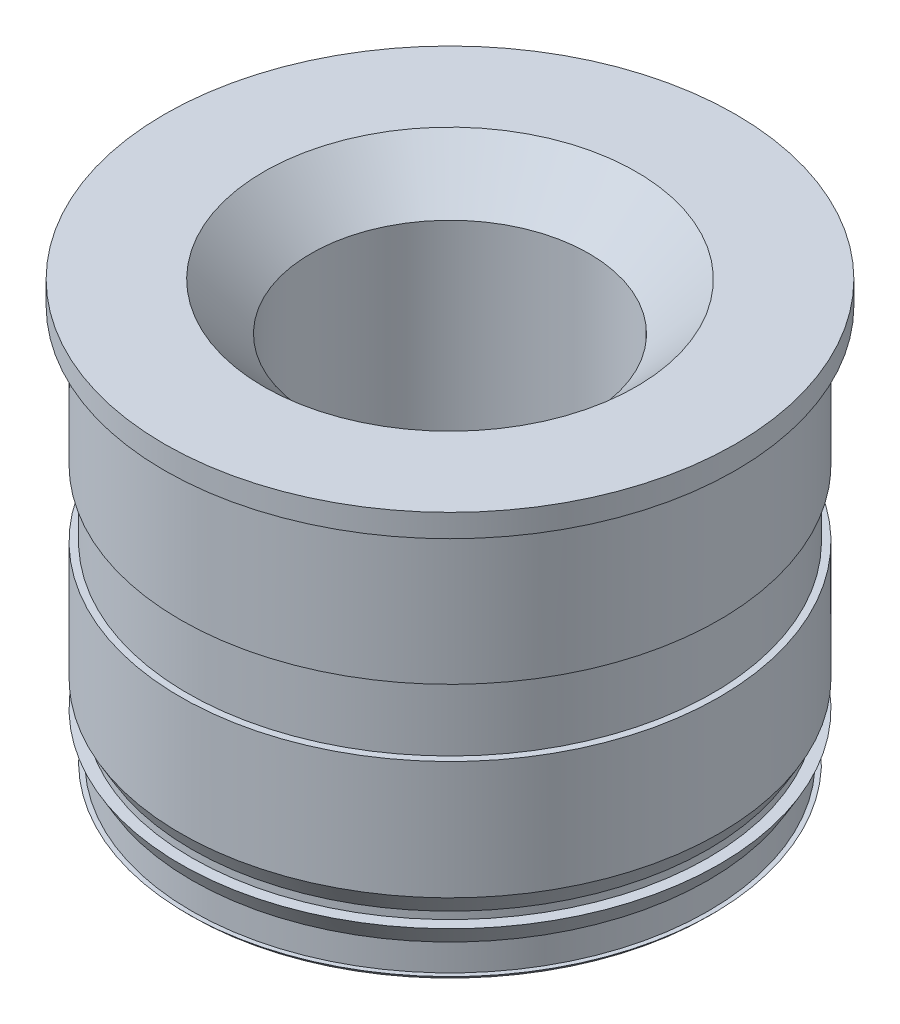
ISO-10303-21;
HEADER;
FILE_DESCRIPTION(('STEP AP214'),'2;1');
FILE_NAME('part.step','',(''),(''),'','','');
FILE_SCHEMA(('AUTOMOTIVE_DESIGN { 1 0 10303 214 1 1 1 1 }'));
ENDSEC;
DATA;
#1=APPLICATION_CONTEXT('core data for automotive mechanical design processes');
#2=APPLICATION_PROTOCOL_DEFINITION('international standard','automotive_design',2000,#1);
#3=PRODUCT_CONTEXT('',#1,'mechanical');
#4=PRODUCT('Part','Part','',(#3));
#5=PRODUCT_RELATED_PRODUCT_CATEGORY('part','',(#4));
#6=PRODUCT_DEFINITION_FORMATION('','',#4);
#7=PRODUCT_DEFINITION_CONTEXT('part definition',#1,'design');
#8=PRODUCT_DEFINITION('design','',#6,#7);
#9=PRODUCT_DEFINITION_SHAPE('','',#8);
#10=(LENGTH_UNIT() NAMED_UNIT(*) SI_UNIT(.MILLI.,.METRE.));
#11=(NAMED_UNIT(*) PLANE_ANGLE_UNIT() SI_UNIT($,.RADIAN.));
#12=(NAMED_UNIT(*) SI_UNIT($,.STERADIAN.) SOLID_ANGLE_UNIT());
#13=UNCERTAINTY_MEASURE_WITH_UNIT(LENGTH_MEASURE(1.E-05),#10,'distance_accuracy_value','');
#14=(GEOMETRIC_REPRESENTATION_CONTEXT(3) GLOBAL_UNCERTAINTY_ASSIGNED_CONTEXT((#13)) GLOBAL_UNIT_ASSIGNED_CONTEXT((#10,
#11,#12)) REPRESENTATION_CONTEXT('',''));
#15=CARTESIAN_POINT('',(0.,0.,0.));
#16=DIRECTION('',(0.,0.,1.));
#17=DIRECTION('',(1.,0.,0.));
#18=AXIS2_PLACEMENT_3D('',#15,#16,#17);
#19=CARTESIAN_POINT('',(0.,-3.83884618943233,0.));
#20=DIRECTION('',(0.,1.,0.));
#21=DIRECTION('',(0.,0.,1.));
#22=AXIS2_PLACEMENT_3D('',#19,#20,#21);
#23=CYLINDRICAL_SURFACE('',#22,2.995);
#24=CARTESIAN_POINT('',(0.,-2.52615127018922,0.));
#25=DIRECTION('',(0.,-1.,0.));
#26=DIRECTION('',(1.,0.,0.));
#27=AXIS2_PLACEMENT_3D('',#24,#25,#26);
#28=CIRCLE('',#27,2.995);
#29=CARTESIAN_POINT('',(2.995,-2.52615127018922,0.));
#30=VERTEX_POINT('',#29);
#31=EDGE_CURVE('E36',#30,#30,#28,.F.);
#32=ORIENTED_EDGE('',*,*,#31,.F.);
#33=EDGE_LOOP('',(#32));
#34=FACE_BOUND('',#33,.T.);
#35=CARTESIAN_POINT('',(0.,-3.83884618943233,0.));
#36=DIRECTION('',(0.,-1.,0.));
#37=DIRECTION('',(0.,0.,-1.));
#38=AXIS2_PLACEMENT_3D('',#35,#36,#37);
#39=CIRCLE('',#38,2.995);
#40=CARTESIAN_POINT('',(0.,-3.83884618943233,-2.995));
#41=VERTEX_POINT('',#40);
#42=EDGE_CURVE('E69',#41,#41,#39,.T.);
#43=ORIENTED_EDGE('',*,*,#42,.F.);
#44=EDGE_LOOP('',(#43));
#45=FACE_BOUND('',#44,.T.);
#46=ADVANCED_FACE('F32',(#34,#45),#23,.T.);
#47=CARTESIAN_POINT('',(0.,-4.7,0.));
#48=DIRECTION('',(0.,1.,0.));
#49=DIRECTION('',(0.,0.,1.));
#50=AXIS2_PLACEMENT_3D('',#47,#48,#49);
#51=CYLINDRICAL_SURFACE('',#50,2.87);
#52=CARTESIAN_POINT('',(0.,-4.13616991924311,0.));
#53=DIRECTION('',(0.,1.,0.));
#54=DIRECTION('',(-1.,0.,0.));
#55=AXIS2_PLACEMENT_3D('',#52,#53,#54);
#56=CIRCLE('',#55,2.87);
#57=CARTESIAN_POINT('',(-2.87,-4.13616991924311,0.));
#58=VERTEX_POINT('',#57);
#59=EDGE_CURVE('E92',#58,#58,#56,.F.);
#60=ORIENTED_EDGE('',*,*,#59,.F.);
#61=EDGE_LOOP('',(#60));
#62=FACE_BOUND('',#61,.T.);
#63=CARTESIAN_POINT('',(0.,-4.05535254037844,0.));
#64=DIRECTION('',(0.,-1.,0.));
#65=DIRECTION('',(0.,0.,-1.));
#66=AXIS2_PLACEMENT_3D('',#63,#64,#65);
#67=CIRCLE('',#66,2.87);
#68=CARTESIAN_POINT('',(0.,-4.05535254037844,-2.87));
#69=VERTEX_POINT('',#68);
#70=EDGE_CURVE('E82',#69,#69,#67,.F.);
#71=ORIENTED_EDGE('',*,*,#70,.F.);
#72=EDGE_LOOP('',(#71));
#73=FACE_BOUND('',#72,.T.);
#74=ADVANCED_FACE('F117',(#62,#73),#51,.T.);
#75=CARTESIAN_POINT('',(0.,-1.78320127018922,0.));
#76=DIRECTION('',(0.,1.,0.));
#77=DIRECTION('',(-1.,0.,0.));
#78=AXIS2_PLACEMENT_3D('',#75,#76,#77);
#79=CIRCLE('',#78,2.995);
#80=CARTESIAN_POINT('',(-2.995,-1.78320127018922,0.));
#81=VERTEX_POINT('',#80);
#82=EDGE_CURVE('E48',#81,#81,#79,.F.);
#83=ORIENTED_EDGE('',*,*,#82,.F.);
#84=EDGE_LOOP('',(#83));
#85=FACE_BOUND('',#84,.T.);
#86=CARTESIAN_POINT('',(0.,-0.254,0.));
#87=DIRECTION('',(0.,1.,0.));
#88=DIRECTION('',(0.,0.,1.));
#89=AXIS2_PLACEMENT_3D('',#86,#87,#88);
#90=CIRCLE('',#89,2.995);
#91=CARTESIAN_POINT('',(0.,-0.254,2.995));
#92=VERTEX_POINT('',#91);
#93=EDGE_CURVE('E76',#92,#92,#90,.F.);
#94=ORIENTED_EDGE('',*,*,#93,.T.);
#95=EDGE_LOOP('',(#94));
#96=FACE_BOUND('',#95,.T.);
#97=ADVANCED_FACE('F120',(#85,#96),#23,.T.);
#98=CARTESIAN_POINT('',(0.,-0.254,0.));
#99=DIRECTION('',(0.,1.,0.));
#100=DIRECTION('',(0.,0.,1.));
#101=AXIS2_PLACEMENT_3D('',#98,#99,#100);
#102=CYLINDRICAL_SURFACE('',#101,3.175);
#103=CARTESIAN_POINT('',(0.,-0.254,0.));
#104=DIRECTION('',(0.,1.,0.));
#105=DIRECTION('',(0.,0.,1.));
#106=AXIS2_PLACEMENT_3D('',#103,#104,#105);
#107=CIRCLE('',#106,3.175);
#108=CARTESIAN_POINT('',(0.,-0.254,3.175));
#109=VERTEX_POINT('',#108);
#110=EDGE_CURVE('E73',#109,#109,#107,.T.);
#111=ORIENTED_EDGE('',*,*,#110,.T.);
#112=EDGE_LOOP('',(#111));
#113=FACE_BOUND('',#112,.T.);
#114=CARTESIAN_POINT('',(0.,0.,0.));
#115=DIRECTION('',(0.,1.,0.));
#116=DIRECTION('',(0.,0.,1.));
#117=AXIS2_PLACEMENT_3D('',#114,#115,#116);
#118=CIRCLE('',#117,3.175);
#119=CARTESIAN_POINT('',(0.,0.,3.175));
#120=VERTEX_POINT('',#119);
#121=EDGE_CURVE('E72',#120,#120,#118,.T.);
#122=ORIENTED_EDGE('',*,*,#121,.F.);
#123=EDGE_LOOP('',(#122));
#124=FACE_BOUND('',#123,.T.);
#125=ADVANCED_FACE('F130',(#113,#124),#102,.T.);
#126=CARTESIAN_POINT('',(0.,-0.254,0.));
#127=DIRECTION('',(0.,1.,0.));
#128=DIRECTION('',(0.,0.,1.));
#129=AXIS2_PLACEMENT_3D('',#126,#127,#128);
#130=PLANE('',#129);
#131=ORIENTED_EDGE('',*,*,#93,.F.);
#132=EDGE_LOOP('',(#131));
#133=FACE_BOUND('',#132,.T.);
#134=ORIENTED_EDGE('',*,*,#110,.F.);
#135=EDGE_LOOP('',(#134));
#136=FACE_BOUND('',#135,.T.);
#137=ADVANCED_FACE('F135',(#133,#136),#130,.F.);
#138=CARTESIAN_POINT('',(0.,0.,0.));
#139=DIRECTION('',(0.,1.,0.));
#140=DIRECTION('',(0.,0.,1.));
#141=AXIS2_PLACEMENT_3D('',#138,#139,#140);
#142=PLANE('',#141);
#143=CARTESIAN_POINT('',(0.,0.,0.));
#144=DIRECTION('',(0.,1.,0.));
#145=DIRECTION('',(0.,0.,1.));
#146=AXIS2_PLACEMENT_3D('',#143,#144,#145);
#147=CIRCLE('',#146,2.07033666301317);
#148=CARTESIAN_POINT('',(0.,0.,2.07033666301317));
#149=VERTEX_POINT('',#148);
#150=EDGE_CURVE('E40',#149,#149,#147,.F.);
#151=ORIENTED_EDGE('',*,*,#150,.T.);
#152=EDGE_LOOP('',(#151));
#153=FACE_BOUND('',#152,.T.);
#154=ORIENTED_EDGE('',*,*,#121,.T.);
#155=EDGE_LOOP('',(#154));
#156=FACE_BOUND('',#155,.T.);
#157=ADVANCED_FACE('F142',(#153,#156),#142,.T.);
#158=CARTESIAN_POINT('',(0.,-3.83884618943233,0.));
#159=DIRECTION('',(0.,1.,0.));
#160=DIRECTION('',(0.,0.,-1.));
#161=AXIS2_PLACEMENT_3D('',#158,#159,#160);
#162=CONICAL_SURFACE('',#161,2.995,0.5235987755983);
#163=ORIENTED_EDGE('',*,*,#70,.T.);
#164=EDGE_LOOP('',(#163));
#165=FACE_BOUND('',#164,.T.);
#166=ORIENTED_EDGE('',*,*,#42,.T.);
#167=EDGE_LOOP('',(#166));
#168=FACE_BOUND('',#167,.T.);
#169=ADVANCED_FACE('F149',(#165,#168),#162,.T.);
#170=CARTESIAN_POINT('',(-2.995,-4.13616991924311,0.));
#171=DIRECTION('',(0.,1.,0.));
#172=DIRECTION('',(-1.,0.,0.));
#173=AXIS2_PLACEMENT_3D('',#170,#171,#172);
#174=PLANE('',#173);
#175=CARTESIAN_POINT('',(0.,-4.13616991924311,0.));
#176=DIRECTION('',(0.,1.,0.));
#177=DIRECTION('',(-1.,0.,0.));
#178=AXIS2_PLACEMENT_3D('',#175,#176,#177);
#179=CIRCLE('',#178,2.995);
#180=CARTESIAN_POINT('',(-2.995,-4.13616991924311,0.));
#181=VERTEX_POINT('',#180);
#182=EDGE_CURVE('E54',#181,#181,#179,.T.);
#183=ORIENTED_EDGE('',*,*,#182,.T.);
#184=EDGE_LOOP('',(#183));
#185=FACE_BOUND('',#184,.T.);
#186=ORIENTED_EDGE('',*,*,#59,.T.);
#187=EDGE_LOOP('',(#186));
#188=FACE_BOUND('',#187,.T.);
#189=ADVANCED_FACE('F155',(#185,#188),#174,.T.);
#190=CARTESIAN_POINT('',(0.,-4.13616991924311,0.));
#191=DIRECTION('',(0.,1.,0.));
#192=DIRECTION('',(-1.,0.,0.));
#193=AXIS2_PLACEMENT_3D('',#190,#191,#192);
#194=CONICAL_SURFACE('',#193,2.995,0.523598775598299);
#195=CARTESIAN_POINT('',(0.,-4.35267627018922,0.));
#196=DIRECTION('',(0.,1.,0.));
#197=DIRECTION('',(-1.,0.,0.));
#198=AXIS2_PLACEMENT_3D('',#195,#196,#197);
#199=CIRCLE('',#198,2.87);
#200=CARTESIAN_POINT('',(-2.87,-4.35267627018922,0.));
#201=VERTEX_POINT('',#200);
#202=EDGE_CURVE('E87',#201,#201,#199,.T.);
#203=ORIENTED_EDGE('',*,*,#202,.T.);
#204=EDGE_LOOP('',(#203));
#205=FACE_BOUND('',#204,.T.);
#206=ORIENTED_EDGE('',*,*,#182,.F.);
#207=EDGE_LOOP('',(#206));
#208=FACE_BOUND('',#207,.T.);
#209=ADVANCED_FACE('F180',(#205,#208),#194,.T.);
#210=CARTESIAN_POINT('',(0.,-4.7,0.));
#211=DIRECTION('',(0.,1.,0.));
#212=DIRECTION('',(0.,0.,1.));
#213=AXIS2_PLACEMENT_3D('',#210,#211,#212);
#214=PLANE('',#213);
#215=CARTESIAN_POINT('',(0.,-4.7,0.));
#216=DIRECTION('',(0.,1.,0.));
#217=DIRECTION('',(0.,0.,1.));
#218=AXIS2_PLACEMENT_3D('',#215,#216,#217);
#219=CIRCLE('',#218,2.07033666301317);
#220=CARTESIAN_POINT('',(0.,-4.7,2.07033666301317));
#221=VERTEX_POINT('',#220);
#222=EDGE_CURVE('E10',#221,#221,#219,.T.);
#223=ORIENTED_EDGE('',*,*,#222,.T.);
#224=EDGE_LOOP('',(#223));
#225=FACE_BOUND('',#224,.T.);
#226=CARTESIAN_POINT('',(0.,-4.7,0.));
#227=DIRECTION('',(0.,1.,0.));
#228=DIRECTION('',(0.,0.,1.));
#229=AXIS2_PLACEMENT_3D('',#226,#227,#228);
#230=CIRCLE('',#229,2.87);
#231=CARTESIAN_POINT('',(0.,-4.7,2.87));
#232=VERTEX_POINT('',#231);
#233=EDGE_CURVE('E79',#232,#232,#230,.T.);
#234=ORIENTED_EDGE('',*,*,#233,.F.);
#235=EDGE_LOOP('',(#234));
#236=FACE_BOUND('',#235,.T.);
#237=ADVANCED_FACE('F158',(#225,#236),#214,.F.);
#238=CARTESIAN_POINT('',(0.,-4.65,0.));
#239=DIRECTION('',(0.,1.,0.));
#240=DIRECTION('',(0.,0.,-1.));
#241=AXIS2_PLACEMENT_3D('',#238,#239,#240);
#242=CONICAL_SURFACE('',#241,2.92,0.78539816339745);
#243=ORIENTED_EDGE('',*,*,#233,.T.);
#244=EDGE_LOOP('',(#243));
#245=FACE_BOUND('',#244,.T.);
#246=CARTESIAN_POINT('',(0.,-4.65,0.));
#247=DIRECTION('',(0.,-1.,0.));
#248=DIRECTION('',(0.,0.,-1.));
#249=AXIS2_PLACEMENT_3D('',#246,#247,#248);
#250=CIRCLE('',#249,2.92);
#251=CARTESIAN_POINT('',(0.,-4.65,-2.92));
#252=VERTEX_POINT('',#251);
#253=EDGE_CURVE('E65',#252,#252,#250,.T.);
#254=ORIENTED_EDGE('',*,*,#253,.T.);
#255=EDGE_LOOP('',(#254));
#256=FACE_BOUND('',#255,.T.);
#257=ADVANCED_FACE('F165',(#245,#256),#242,.T.);
#258=CARTESIAN_POINT('',(0.,-4.65,0.));
#259=DIRECTION('',(0.,-1.,0.));
#260=DIRECTION('',(0.,0.,-1.));
#261=AXIS2_PLACEMENT_3D('',#258,#259,#260);
#262=PLANE('',#261);
#263=CARTESIAN_POINT('',(0.,-4.65,0.));
#264=DIRECTION('',(0.,-1.,0.));
#265=DIRECTION('',(0.,0.,-1.));
#266=AXIS2_PLACEMENT_3D('',#263,#264,#265);
#267=CIRCLE('',#266,2.87);
#268=CARTESIAN_POINT('',(0.,-4.65,-2.87));
#269=VERTEX_POINT('',#268);
#270=EDGE_CURVE('E68',#269,#269,#267,.F.);
#271=ORIENTED_EDGE('',*,*,#270,.F.);
#272=EDGE_LOOP('',(#271));
#273=FACE_BOUND('',#272,.T.);
#274=ORIENTED_EDGE('',*,*,#253,.F.);
#275=EDGE_LOOP('',(#274));
#276=FACE_BOUND('',#275,.T.);
#277=ADVANCED_FACE('F160',(#273,#276),#262,.F.);
#278=ORIENTED_EDGE('',*,*,#202,.F.);
#279=EDGE_LOOP('',(#278));
#280=FACE_BOUND('',#279,.T.);
#281=ORIENTED_EDGE('',*,*,#270,.T.);
#282=EDGE_LOOP('',(#281));
#283=FACE_BOUND('',#282,.T.);
#284=ADVANCED_FACE('F112',(#280,#283),#51,.T.);
#285=CARTESIAN_POINT('',(0.,-4.7,0.));
#286=DIRECTION('',(0.,1.,0.));
#287=DIRECTION('',(0.,0.,1.));
#288=AXIS2_PLACEMENT_3D('',#285,#286,#287);
#289=CYLINDRICAL_SURFACE('',#288,1.54533666301317);
#290=CARTESIAN_POINT('',(0.,-0.524999999999998,0.));
#291=DIRECTION('',(0.,1.,0.));
#292=DIRECTION('',(0.,0.,1.));
#293=AXIS2_PLACEMENT_3D('',#290,#291,#292);
#294=CIRCLE('',#293,1.54533666301317);
#295=CARTESIAN_POINT('',(0.,-0.524999999999998,1.54533666301317));
#296=VERTEX_POINT('',#295);
#297=EDGE_CURVE('E45',#296,#296,#294,.T.);
#298=ORIENTED_EDGE('',*,*,#297,.T.);
#299=EDGE_LOOP('',(#298));
#300=FACE_BOUND('',#299,.T.);
#301=CARTESIAN_POINT('',(0.,-4.175,0.));
#302=DIRECTION('',(0.,1.,0.));
#303=DIRECTION('',(0.,0.,1.));
#304=AXIS2_PLACEMENT_3D('',#301,#302,#303);
#305=CIRCLE('',#304,1.54533666301317);
#306=CARTESIAN_POINT('',(0.,-4.175,1.54533666301317));
#307=VERTEX_POINT('',#306);
#308=EDGE_CURVE('E95',#307,#307,#305,.F.);
#309=ORIENTED_EDGE('',*,*,#308,.T.);
#310=EDGE_LOOP('',(#309));
#311=FACE_BOUND('',#310,.T.);
#312=ADVANCED_FACE('F100',(#300,#311),#289,.F.);
#313=CARTESIAN_POINT('',(0.,-0.524999999999998,0.));
#314=DIRECTION('',(0.,1.,0.));
#315=DIRECTION('',(0.,0.,1.));
#316=AXIS2_PLACEMENT_3D('',#313,#314,#315);
#317=CONICAL_SURFACE('',#316,1.54533666301317,0.785398163397452);
#318=ORIENTED_EDGE('',*,*,#150,.F.);
#319=EDGE_LOOP('',(#318));
#320=FACE_BOUND('',#319,.T.);
#321=ORIENTED_EDGE('',*,*,#297,.F.);
#322=EDGE_LOOP('',(#321));
#323=FACE_BOUND('',#322,.T.);
#324=ADVANCED_FACE('F103',(#320,#323),#317,.F.);
#325=CARTESIAN_POINT('',(0.,-4.7,0.));
#326=DIRECTION('',(0.,-1.,0.));
#327=DIRECTION('',(0.,0.,-1.));
#328=AXIS2_PLACEMENT_3D('',#325,#326,#327);
#329=CONICAL_SURFACE('',#328,2.07033666301317,0.785398163397448);
#330=ORIENTED_EDGE('',*,*,#308,.F.);
#331=EDGE_LOOP('',(#330));
#332=FACE_BOUND('',#331,.T.);
#333=ORIENTED_EDGE('',*,*,#222,.F.);
#334=EDGE_LOOP('',(#333));
#335=FACE_BOUND('',#334,.T.);
#336=ADVANCED_FACE('F34',(#332,#335),#329,.F.);
#337=CARTESIAN_POINT('',(-3.175,-2.52615127018922,0.));
#338=DIRECTION('',(0.,-1.,0.));
#339=DIRECTION('',(1.,0.,0.));
#340=AXIS2_PLACEMENT_3D('',#337,#338,#339);
#341=PLANE('',#340);
#342=ORIENTED_EDGE('',*,*,#31,.T.);
#343=EDGE_LOOP('',(#342));
#344=FACE_BOUND('',#343,.T.);
#345=CARTESIAN_POINT('',(0.,-2.52615127018922,0.));
#346=DIRECTION('',(0.,1.,0.));
#347=DIRECTION('',(-1.,0.,0.));
#348=AXIS2_PLACEMENT_3D('',#345,#346,#347);
#349=CIRCLE('',#348,2.92);
#350=CARTESIAN_POINT('',(-2.92,-2.52615127018922,0.));
#351=VERTEX_POINT('',#350);
#352=EDGE_CURVE('E50',#351,#351,#349,.T.);
#353=ORIENTED_EDGE('',*,*,#352,.F.);
#354=EDGE_LOOP('',(#353));
#355=FACE_BOUND('',#354,.T.);
#356=ADVANCED_FACE('F110',(#344,#355),#341,.F.);
#357=CARTESIAN_POINT('',(0.,0.,0.));
#358=DIRECTION('',(0.,1.,0.));
#359=DIRECTION('',(-1.,0.,0.));
#360=AXIS2_PLACEMENT_3D('',#357,#358,#359);
#361=CYLINDRICAL_SURFACE('',#360,2.92);
#362=CARTESIAN_POINT('',(0.,-1.78320127018922,0.));
#363=DIRECTION('',(0.,1.,0.));
#364=DIRECTION('',(-1.,0.,0.));
#365=AXIS2_PLACEMENT_3D('',#362,#363,#364);
#366=CIRCLE('',#365,2.92);
#367=CARTESIAN_POINT('',(-2.92,-1.78320127018922,0.));
#368=VERTEX_POINT('',#367);
#369=EDGE_CURVE('E56',#368,#368,#366,.T.);
#370=ORIENTED_EDGE('',*,*,#369,.F.);
#371=EDGE_LOOP('',(#370));
#372=FACE_BOUND('',#371,.T.);
#373=ORIENTED_EDGE('',*,*,#352,.T.);
#374=EDGE_LOOP('',(#373));
#375=FACE_BOUND('',#374,.T.);
#376=ADVANCED_FACE('F190',(#372,#375),#361,.T.);
#377=CARTESIAN_POINT('',(-3.175,-1.78320127018922,0.));
#378=DIRECTION('',(0.,1.,0.));
#379=DIRECTION('',(-1.,0.,0.));
#380=AXIS2_PLACEMENT_3D('',#377,#378,#379);
#381=PLANE('',#380);
#382=ORIENTED_EDGE('',*,*,#82,.T.);
#383=EDGE_LOOP('',(#382));
#384=FACE_BOUND('',#383,.T.);
#385=ORIENTED_EDGE('',*,*,#369,.T.);
#386=EDGE_LOOP('',(#385));
#387=FACE_BOUND('',#386,.T.);
#388=ADVANCED_FACE('F194',(#384,#387),#381,.F.);
#389=CLOSED_SHELL('',(#46,#74,#97,#125,#137,#157,#169,#189,#209,#237,#257,#277,#284,#312,#324,
#336,#356,#376,#388));
#390=MANIFOLD_SOLID_BREP('B2',#389);
#391=ADVANCED_BREP_SHAPE_REPRESENTATION('',(#18,#390),#14);
#392=SHAPE_DEFINITION_REPRESENTATION(#9,#391);
ENDSEC;
END-ISO-10303-21;
